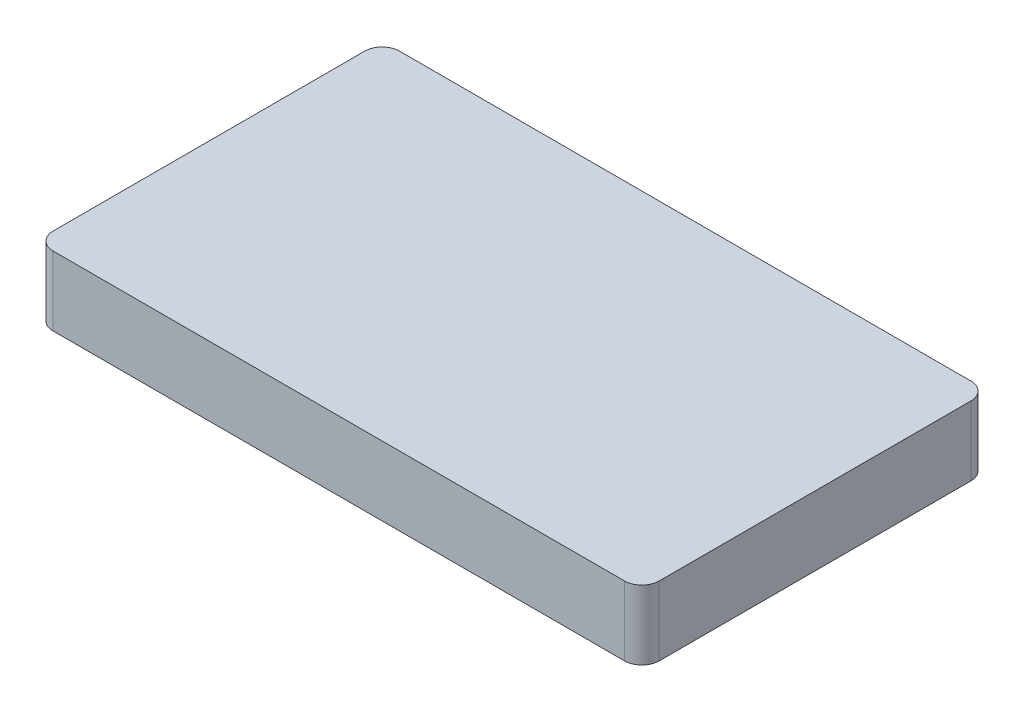
ISO-10303-21;
HEADER;
FILE_DESCRIPTION(('STEP AP214'),'2;1');
FILE_NAME('part.step','',(''),(''),'','','');
FILE_SCHEMA(('AUTOMOTIVE_DESIGN { 1 0 10303 214 1 1 1 1 }'));
ENDSEC;
DATA;
#1=APPLICATION_CONTEXT('core data for automotive mechanical design processes');
#2=APPLICATION_PROTOCOL_DEFINITION('international standard','automotive_design',2000,#1);
#3=PRODUCT_CONTEXT('',#1,'mechanical');
#4=PRODUCT('Part','Part','',(#3));
#5=PRODUCT_RELATED_PRODUCT_CATEGORY('part','',(#4));
#6=PRODUCT_DEFINITION_FORMATION('','',#4);
#7=PRODUCT_DEFINITION_CONTEXT('part definition',#1,'design');
#8=PRODUCT_DEFINITION('design','',#6,#7);
#9=PRODUCT_DEFINITION_SHAPE('','',#8);
#10=(LENGTH_UNIT() NAMED_UNIT(*) SI_UNIT(.MILLI.,.METRE.));
#11=(NAMED_UNIT(*) PLANE_ANGLE_UNIT() SI_UNIT($,.RADIAN.));
#12=(NAMED_UNIT(*) SI_UNIT($,.STERADIAN.) SOLID_ANGLE_UNIT());
#13=UNCERTAINTY_MEASURE_WITH_UNIT(LENGTH_MEASURE(1.E-05),#10,'distance_accuracy_value','');
#14=(GEOMETRIC_REPRESENTATION_CONTEXT(3) GLOBAL_UNCERTAINTY_ASSIGNED_CONTEXT((#13)) GLOBAL_UNIT_ASSIGNED_CONTEXT((#10,
#11,#12)) REPRESENTATION_CONTEXT('',''));
#15=CARTESIAN_POINT('',(0.,0.,0.));
#16=DIRECTION('',(0.,0.,1.));
#17=DIRECTION('',(1.,0.,0.));
#18=AXIS2_PLACEMENT_3D('',#15,#16,#17);
#19=CARTESIAN_POINT('',(0.,2.54,-12.7));
#20=DIRECTION('',(1.,0.,0.));
#21=DIRECTION('',(0.,0.,-1.));
#22=AXIS2_PLACEMENT_3D('',#19,#20,#21);
#23=PLANE('',#22);
#24=DIRECTION('',(0.,0.,1.));
#25=VECTOR('',#24,1.);
#26=CARTESIAN_POINT('',(0.,2.54,-12.7));
#27=LINE('',#26,#25);
#28=CARTESIAN_POINT('',(0.,2.54,-12.065));
#29=VERTEX_POINT('',#28);
#30=CARTESIAN_POINT('',(0.,2.54,-0.635));
#31=VERTEX_POINT('',#30);
#32=EDGE_CURVE('E161',#29,#31,#27,.T.);
#33=ORIENTED_EDGE('',*,*,#32,.F.);
#34=DIRECTION('',(0.,-1.,0.));
#35=VECTOR('',#34,1.);
#36=CARTESIAN_POINT('',(0.,2.54,-12.065));
#37=LINE('',#36,#35);
#38=CARTESIAN_POINT('',(0.,0.,-12.065));
#39=VERTEX_POINT('',#38);
#40=EDGE_CURVE('E186',#29,#39,#37,.T.);
#41=ORIENTED_EDGE('',*,*,#40,.T.);
#42=DIRECTION('',(0.,0.,1.));
#43=VECTOR('',#42,1.);
#44=CARTESIAN_POINT('',(0.,0.,-12.7));
#45=LINE('',#44,#43);
#46=CARTESIAN_POINT('',(0.,0.,-0.635));
#47=VERTEX_POINT('',#46);
#48=EDGE_CURVE('E174',#39,#47,#45,.T.);
#49=ORIENTED_EDGE('',*,*,#48,.T.);
#50=DIRECTION('',(0.,-1.,0.));
#51=VECTOR('',#50,1.);
#52=CARTESIAN_POINT('',(0.,2.54,-0.635));
#53=LINE('',#52,#51);
#54=EDGE_CURVE('E173',#47,#31,#53,.F.);
#55=ORIENTED_EDGE('',*,*,#54,.T.);
#56=EDGE_LOOP('',(#33,#41,#49,#55));
#57=FACE_BOUND('',#56,.T.);
#58=ADVANCED_FACE('F32',(#57),#23,.F.);
#59=CARTESIAN_POINT('',(0.,2.54,0.));
#60=DIRECTION('',(0.,0.,-1.));
#61=DIRECTION('',(-1.,0.,0.));
#62=AXIS2_PLACEMENT_3D('',#59,#60,#61);
#63=PLANE('',#62);
#64=DIRECTION('',(1.,0.,0.));
#65=VECTOR('',#64,1.);
#66=CARTESIAN_POINT('',(0.,0.,0.));
#67=LINE('',#66,#65);
#68=CARTESIAN_POINT('',(0.635,0.,0.));
#69=VERTEX_POINT('',#68);
#70=CARTESIAN_POINT('',(21.59,0.,0.));
#71=VERTEX_POINT('',#70);
#72=EDGE_CURVE('E177',#69,#71,#67,.T.);
#73=ORIENTED_EDGE('',*,*,#72,.T.);
#74=DIRECTION('',(0.,-1.,0.));
#75=VECTOR('',#74,1.);
#76=CARTESIAN_POINT('',(21.59,2.54,0.));
#77=LINE('',#76,#75);
#78=CARTESIAN_POINT('',(21.59,2.54,0.));
#79=VERTEX_POINT('',#78);
#80=EDGE_CURVE('E40',#71,#79,#77,.F.);
#81=ORIENTED_EDGE('',*,*,#80,.T.);
#82=DIRECTION('',(1.,0.,0.));
#83=VECTOR('',#82,1.);
#84=CARTESIAN_POINT('',(0.,2.54,0.));
#85=LINE('',#84,#83);
#86=CARTESIAN_POINT('',(0.635,2.54,0.));
#87=VERTEX_POINT('',#86);
#88=EDGE_CURVE('E164',#87,#79,#85,.T.);
#89=ORIENTED_EDGE('',*,*,#88,.F.);
#90=DIRECTION('',(0.,-1.,0.));
#91=VECTOR('',#90,1.);
#92=CARTESIAN_POINT('',(0.635,2.54,0.));
#93=LINE('',#92,#91);
#94=EDGE_CURVE('E214',#87,#69,#93,.T.);
#95=ORIENTED_EDGE('',*,*,#94,.T.);
#96=EDGE_LOOP('',(#73,#81,#89,#95));
#97=FACE_BOUND('',#96,.T.);
#98=ADVANCED_FACE('F219',(#97),#63,.F.);
#99=CARTESIAN_POINT('',(22.225,2.54,0.));
#100=DIRECTION('',(-1.,0.,0.));
#101=DIRECTION('',(0.,0.,1.));
#102=AXIS2_PLACEMENT_3D('',#99,#100,#101);
#103=PLANE('',#102);
#104=DIRECTION('',(0.,0.,-1.));
#105=VECTOR('',#104,1.);
#106=CARTESIAN_POINT('',(22.225,0.,0.));
#107=LINE('',#106,#105);
#108=CARTESIAN_POINT('',(22.225,0.,-0.635));
#109=VERTEX_POINT('',#108);
#110=CARTESIAN_POINT('',(22.225,0.,-12.065));
#111=VERTEX_POINT('',#110);
#112=EDGE_CURVE('E181',#109,#111,#107,.T.);
#113=ORIENTED_EDGE('',*,*,#112,.T.);
#114=DIRECTION('',(0.,-1.,0.));
#115=VECTOR('',#114,1.);
#116=CARTESIAN_POINT('',(22.225,2.54,-12.065));
#117=LINE('',#116,#115);
#118=CARTESIAN_POINT('',(22.225,2.54,-12.065));
#119=VERTEX_POINT('',#118);
#120=EDGE_CURVE('E55',#111,#119,#117,.F.);
#121=ORIENTED_EDGE('',*,*,#120,.T.);
#122=DIRECTION('',(0.,0.,-1.));
#123=VECTOR('',#122,1.);
#124=CARTESIAN_POINT('',(22.225,2.54,0.));
#125=LINE('',#124,#123);
#126=CARTESIAN_POINT('',(22.225,2.54,-0.635));
#127=VERTEX_POINT('',#126);
#128=EDGE_CURVE('E168',#127,#119,#125,.T.);
#129=ORIENTED_EDGE('',*,*,#128,.F.);
#130=DIRECTION('',(0.,-1.,0.));
#131=VECTOR('',#130,1.);
#132=CARTESIAN_POINT('',(22.225,2.54,-0.635));
#133=LINE('',#132,#131);
#134=EDGE_CURVE('E210',#127,#109,#133,.T.);
#135=ORIENTED_EDGE('',*,*,#134,.T.);
#136=EDGE_LOOP('',(#113,#121,#129,#135));
#137=FACE_BOUND('',#136,.T.);
#138=ADVANCED_FACE('F230',(#137),#103,.F.);
#139=CARTESIAN_POINT('',(22.225,2.54,-12.7));
#140=DIRECTION('',(0.,0.,1.));
#141=DIRECTION('',(1.,0.,0.));
#142=AXIS2_PLACEMENT_3D('',#139,#140,#141);
#143=PLANE('',#142);
#144=DIRECTION('',(-1.,0.,0.));
#145=VECTOR('',#144,1.);
#146=CARTESIAN_POINT('',(22.225,0.,-12.7));
#147=LINE('',#146,#145);
#148=CARTESIAN_POINT('',(21.59,0.,-12.7));
#149=VERTEX_POINT('',#148);
#150=CARTESIAN_POINT('',(0.634999999999997,0.,-12.7));
#151=VERTEX_POINT('',#150);
#152=EDGE_CURVE('E165',#149,#151,#147,.T.);
#153=ORIENTED_EDGE('',*,*,#152,.T.);
#154=DIRECTION('',(0.,-1.,0.));
#155=VECTOR('',#154,1.);
#156=CARTESIAN_POINT('',(0.634999999999997,2.54,-12.7));
#157=LINE('',#156,#155);
#158=CARTESIAN_POINT('',(0.634999999999997,2.54,-12.7));
#159=VERTEX_POINT('',#158);
#160=EDGE_CURVE('E200',#151,#159,#157,.F.);
#161=ORIENTED_EDGE('',*,*,#160,.T.);
#162=DIRECTION('',(-1.,0.,0.));
#163=VECTOR('',#162,1.);
#164=CARTESIAN_POINT('',(22.225,2.54,-12.7));
#165=LINE('',#164,#163);
#166=CARTESIAN_POINT('',(21.59,2.54,-12.7));
#167=VERTEX_POINT('',#166);
#168=EDGE_CURVE('E170',#167,#159,#165,.T.);
#169=ORIENTED_EDGE('',*,*,#168,.F.);
#170=DIRECTION('',(0.,-1.,0.));
#171=VECTOR('',#170,1.);
#172=CARTESIAN_POINT('',(21.59,2.54,-12.7));
#173=LINE('',#172,#171);
#174=EDGE_CURVE('E197',#167,#149,#173,.T.);
#175=ORIENTED_EDGE('',*,*,#174,.T.);
#176=EDGE_LOOP('',(#153,#161,#169,#175));
#177=FACE_BOUND('',#176,.T.);
#178=ADVANCED_FACE('F241',(#177),#143,.F.);
#179=CARTESIAN_POINT('',(0.,2.54,0.));
#180=DIRECTION('',(0.,1.,0.));
#181=DIRECTION('',(0.,0.,1.));
#182=AXIS2_PLACEMENT_3D('',#179,#180,#181);
#183=PLANE('',#182);
#184=ORIENTED_EDGE('',*,*,#168,.T.);
#185=CARTESIAN_POINT('',(0.634999999999995,2.54,-12.065));
#186=DIRECTION('',(0.,1.,0.));
#187=DIRECTION('',(0.,0.,1.));
#188=AXIS2_PLACEMENT_3D('',#185,#186,#187);
#189=CIRCLE('',#188,0.635);
#190=EDGE_CURVE('E208',#159,#29,#189,.T.);
#191=ORIENTED_EDGE('',*,*,#190,.T.);
#192=ORIENTED_EDGE('',*,*,#32,.T.);
#193=CARTESIAN_POINT('',(0.635,2.54,-0.635));
#194=DIRECTION('',(0.,1.,0.));
#195=DIRECTION('',(0.,0.,1.));
#196=AXIS2_PLACEMENT_3D('',#193,#194,#195);
#197=CIRCLE('',#196,0.635);
#198=EDGE_CURVE('E202',#31,#87,#197,.T.);
#199=ORIENTED_EDGE('',*,*,#198,.T.);
#200=ORIENTED_EDGE('',*,*,#88,.T.);
#201=CARTESIAN_POINT('',(21.59,2.54,-0.635));
#202=DIRECTION('',(0.,1.,0.));
#203=DIRECTION('',(0.,0.,1.));
#204=AXIS2_PLACEMENT_3D('',#201,#202,#203);
#205=CIRCLE('',#204,0.635);
#206=EDGE_CURVE('E204',#79,#127,#205,.T.);
#207=ORIENTED_EDGE('',*,*,#206,.T.);
#208=ORIENTED_EDGE('',*,*,#128,.T.);
#209=CARTESIAN_POINT('',(21.59,2.54,-12.065));
#210=DIRECTION('',(0.,1.,0.));
#211=DIRECTION('',(0.,0.,1.));
#212=AXIS2_PLACEMENT_3D('',#209,#210,#211);
#213=CIRCLE('',#212,0.635);
#214=EDGE_CURVE('E206',#119,#167,#213,.T.);
#215=ORIENTED_EDGE('',*,*,#214,.T.);
#216=EDGE_LOOP('',(#184,#191,#192,#199,#200,#207,#208,#215));
#217=FACE_BOUND('',#216,.T.);
#218=ADVANCED_FACE('F225',(#217),#183,.T.);
#219=CARTESIAN_POINT('',(0.,0.,0.));
#220=DIRECTION('',(0.,1.,0.));
#221=DIRECTION('',(0.,0.,1.));
#222=AXIS2_PLACEMENT_3D('',#219,#220,#221);
#223=PLANE('',#222);
#224=DIRECTION('',(-1.,0.,0.));
#225=VECTOR('',#224,1.);
#226=CARTESIAN_POINT('',(22.225,0.,-12.065));
#227=LINE('',#226,#225);
#228=CARTESIAN_POINT('',(21.59,0.,-12.065));
#229=VERTEX_POINT('',#228);
#230=CARTESIAN_POINT('',(0.634999999999995,0.,-12.065));
#231=VERTEX_POINT('',#230);
#232=EDGE_CURVE('E133',#229,#231,#227,.T.);
#233=ORIENTED_EDGE('',*,*,#232,.T.);
#234=DIRECTION('',(0.,0.,1.));
#235=VECTOR('',#234,1.);
#236=CARTESIAN_POINT('',(0.634999999999995,0.,-12.7));
#237=LINE('',#236,#235);
#238=CARTESIAN_POINT('',(0.635,0.,-0.635));
#239=VERTEX_POINT('',#238);
#240=EDGE_CURVE('E139',#231,#239,#237,.T.);
#241=ORIENTED_EDGE('',*,*,#240,.T.);
#242=DIRECTION('',(1.,0.,0.));
#243=VECTOR('',#242,1.);
#244=CARTESIAN_POINT('',(0.,0.,-0.635));
#245=LINE('',#244,#243);
#246=CARTESIAN_POINT('',(21.59,0.,-0.635));
#247=VERTEX_POINT('',#246);
#248=EDGE_CURVE('E155',#239,#247,#245,.T.);
#249=ORIENTED_EDGE('',*,*,#248,.T.);
#250=DIRECTION('',(0.,0.,-1.));
#251=VECTOR('',#250,1.);
#252=CARTESIAN_POINT('',(21.59,0.,0.));
#253=LINE('',#252,#251);
#254=EDGE_CURVE('E47',#247,#229,#253,.T.);
#255=ORIENTED_EDGE('',*,*,#254,.T.);
#256=EDGE_LOOP('',(#233,#241,#249,#255));
#257=FACE_BOUND('',#256,.T.);
#258=ORIENTED_EDGE('',*,*,#48,.F.);
#259=CARTESIAN_POINT('',(0.634999999999995,0.,-12.065));
#260=DIRECTION('',(0.,1.,0.));
#261=DIRECTION('',(0.,0.,1.));
#262=AXIS2_PLACEMENT_3D('',#259,#260,#261);
#263=CIRCLE('',#262,0.635);
#264=EDGE_CURVE('E195',#39,#151,#263,.F.);
#265=ORIENTED_EDGE('',*,*,#264,.T.);
#266=ORIENTED_EDGE('',*,*,#152,.F.);
#267=CARTESIAN_POINT('',(21.59,0.,-12.065));
#268=DIRECTION('',(0.,1.,0.));
#269=DIRECTION('',(0.,0.,1.));
#270=AXIS2_PLACEMENT_3D('',#267,#268,#269);
#271=CIRCLE('',#270,0.635);
#272=EDGE_CURVE('E193',#149,#111,#271,.F.);
#273=ORIENTED_EDGE('',*,*,#272,.T.);
#274=ORIENTED_EDGE('',*,*,#112,.F.);
#275=CARTESIAN_POINT('',(21.59,0.,-0.635));
#276=DIRECTION('',(0.,1.,0.));
#277=DIRECTION('',(0.,0.,1.));
#278=AXIS2_PLACEMENT_3D('',#275,#276,#277);
#279=CIRCLE('',#278,0.635);
#280=EDGE_CURVE('E191',#109,#71,#279,.F.);
#281=ORIENTED_EDGE('',*,*,#280,.T.);
#282=ORIENTED_EDGE('',*,*,#72,.F.);
#283=CARTESIAN_POINT('',(0.635,0.,-0.635));
#284=DIRECTION('',(0.,1.,0.));
#285=DIRECTION('',(0.,0.,1.));
#286=AXIS2_PLACEMENT_3D('',#283,#284,#285);
#287=CIRCLE('',#286,0.635);
#288=EDGE_CURVE('E189',#69,#47,#287,.F.);
#289=ORIENTED_EDGE('',*,*,#288,.T.);
#290=EDGE_LOOP('',(#258,#265,#266,#273,#274,#281,#282,#289));
#291=FACE_BOUND('',#290,.T.);
#292=ADVANCED_FACE('F233',(#257,#291),#223,.F.);
#293=CARTESIAN_POINT('',(0.634999999999995,2.54,-12.065));
#294=DIRECTION('',(0.,-1.,0.));
#295=DIRECTION('',(0.,0.,-1.));
#296=AXIS2_PLACEMENT_3D('',#293,#294,#295);
#297=CYLINDRICAL_SURFACE('',#296,0.635);
#298=ORIENTED_EDGE('',*,*,#190,.F.);
#299=ORIENTED_EDGE('',*,*,#160,.F.);
#300=ORIENTED_EDGE('',*,*,#264,.F.);
#301=ORIENTED_EDGE('',*,*,#40,.F.);
#302=EDGE_LOOP('',(#298,#299,#300,#301));
#303=FACE_BOUND('',#302,.T.);
#304=ADVANCED_FACE('F247',(#303),#297,.T.);
#305=CARTESIAN_POINT('',(21.59,2.54,-12.065));
#306=DIRECTION('',(0.,-1.,0.));
#307=DIRECTION('',(0.,0.,-1.));
#308=AXIS2_PLACEMENT_3D('',#305,#306,#307);
#309=CYLINDRICAL_SURFACE('',#308,0.635);
#310=ORIENTED_EDGE('',*,*,#214,.F.);
#311=ORIENTED_EDGE('',*,*,#120,.F.);
#312=ORIENTED_EDGE('',*,*,#272,.F.);
#313=ORIENTED_EDGE('',*,*,#174,.F.);
#314=EDGE_LOOP('',(#310,#311,#312,#313));
#315=FACE_BOUND('',#314,.T.);
#316=ADVANCED_FACE('F238',(#315),#309,.T.);
#317=CARTESIAN_POINT('',(21.59,2.54,-0.635));
#318=DIRECTION('',(0.,-1.,0.));
#319=DIRECTION('',(0.,0.,-1.));
#320=AXIS2_PLACEMENT_3D('',#317,#318,#319);
#321=CYLINDRICAL_SURFACE('',#320,0.635);
#322=ORIENTED_EDGE('',*,*,#206,.F.);
#323=ORIENTED_EDGE('',*,*,#80,.F.);
#324=ORIENTED_EDGE('',*,*,#280,.F.);
#325=ORIENTED_EDGE('',*,*,#134,.F.);
#326=EDGE_LOOP('',(#322,#323,#324,#325));
#327=FACE_BOUND('',#326,.T.);
#328=ADVANCED_FACE('F228',(#327),#321,.T.);
#329=CARTESIAN_POINT('',(0.635,2.54,-0.635));
#330=DIRECTION('',(0.,-1.,0.));
#331=DIRECTION('',(0.,0.,-1.));
#332=AXIS2_PLACEMENT_3D('',#329,#330,#331);
#333=CYLINDRICAL_SURFACE('',#332,0.635);
#334=ORIENTED_EDGE('',*,*,#198,.F.);
#335=ORIENTED_EDGE('',*,*,#54,.F.);
#336=ORIENTED_EDGE('',*,*,#288,.F.);
#337=ORIENTED_EDGE('',*,*,#94,.F.);
#338=EDGE_LOOP('',(#334,#335,#336,#337));
#339=FACE_BOUND('',#338,.T.);
#340=ADVANCED_FACE('F34',(#339),#333,.T.);
#341=CARTESIAN_POINT('',(0.634999999999995,2.54,-12.7));
#342=DIRECTION('',(1.,0.,0.));
#343=DIRECTION('',(0.,0.,-1.));
#344=AXIS2_PLACEMENT_3D('',#341,#342,#343);
#345=PLANE('',#344);
#346=DIRECTION('',(0.,0.,1.));
#347=VECTOR('',#346,1.);
#348=CARTESIAN_POINT('',(0.634999999999995,1.905,-12.7));
#349=LINE('',#348,#347);
#350=CARTESIAN_POINT('',(0.634999999999995,1.905,-12.065));
#351=VERTEX_POINT('',#350);
#352=CARTESIAN_POINT('',(0.635,1.905,-0.635));
#353=VERTEX_POINT('',#352);
#354=EDGE_CURVE('E123',#351,#353,#349,.T.);
#355=ORIENTED_EDGE('',*,*,#354,.T.);
#356=DIRECTION('',(0.,1.,0.));
#357=VECTOR('',#356,1.);
#358=CARTESIAN_POINT('',(0.635,2.54,-0.635));
#359=LINE('',#358,#357);
#360=EDGE_CURVE('E144',#239,#353,#359,.T.);
#361=ORIENTED_EDGE('',*,*,#360,.F.);
#362=ORIENTED_EDGE('',*,*,#240,.F.);
#363=DIRECTION('',(0.,1.,0.));
#364=VECTOR('',#363,1.);
#365=CARTESIAN_POINT('',(0.634999999999993,2.54,-12.065));
#366=LINE('',#365,#364);
#367=EDGE_CURVE('E136',#231,#351,#366,.T.);
#368=ORIENTED_EDGE('',*,*,#367,.T.);
#369=EDGE_LOOP('',(#355,#361,#362,#368));
#370=FACE_BOUND('',#369,.T.);
#371=ADVANCED_FACE('F137',(#370),#345,.T.);
#372=CARTESIAN_POINT('',(0.,2.54,-0.635));
#373=DIRECTION('',(0.,0.,-1.));
#374=DIRECTION('',(-1.,0.,0.));
#375=AXIS2_PLACEMENT_3D('',#372,#373,#374);
#376=PLANE('',#375);
#377=ORIENTED_EDGE('',*,*,#248,.F.);
#378=ORIENTED_EDGE('',*,*,#360,.T.);
#379=DIRECTION('',(1.,0.,0.));
#380=VECTOR('',#379,1.);
#381=CARTESIAN_POINT('',(0.,1.905,-0.635));
#382=LINE('',#381,#380);
#383=CARTESIAN_POINT('',(21.59,1.905,-0.635));
#384=VERTEX_POINT('',#383);
#385=EDGE_CURVE('E130',#353,#384,#382,.T.);
#386=ORIENTED_EDGE('',*,*,#385,.T.);
#387=DIRECTION('',(0.,1.,0.));
#388=VECTOR('',#387,1.);
#389=CARTESIAN_POINT('',(21.59,2.54,-0.635));
#390=LINE('',#389,#388);
#391=EDGE_CURVE('E178',#247,#384,#390,.T.);
#392=ORIENTED_EDGE('',*,*,#391,.F.);
#393=EDGE_LOOP('',(#377,#378,#386,#392));
#394=FACE_BOUND('',#393,.T.);
#395=ADVANCED_FACE('F256',(#394),#376,.T.);
#396=CARTESIAN_POINT('',(21.59,2.54,0.));
#397=DIRECTION('',(-1.,0.,0.));
#398=DIRECTION('',(0.,0.,1.));
#399=AXIS2_PLACEMENT_3D('',#396,#397,#398);
#400=PLANE('',#399);
#401=ORIENTED_EDGE('',*,*,#254,.F.);
#402=ORIENTED_EDGE('',*,*,#391,.T.);
#403=DIRECTION('',(0.,0.,-1.));
#404=VECTOR('',#403,1.);
#405=CARTESIAN_POINT('',(21.59,1.905,0.));
#406=LINE('',#405,#404);
#407=CARTESIAN_POINT('',(21.59,1.905,-12.065));
#408=VERTEX_POINT('',#407);
#409=EDGE_CURVE('E148',#384,#408,#406,.T.);
#410=ORIENTED_EDGE('',*,*,#409,.T.);
#411=DIRECTION('',(0.,1.,0.));
#412=VECTOR('',#411,1.);
#413=CARTESIAN_POINT('',(21.59,2.54,-12.065));
#414=LINE('',#413,#412);
#415=EDGE_CURVE('E143',#229,#408,#414,.T.);
#416=ORIENTED_EDGE('',*,*,#415,.F.);
#417=EDGE_LOOP('',(#401,#402,#410,#416));
#418=FACE_BOUND('',#417,.T.);
#419=ADVANCED_FACE('F308',(#418),#400,.T.);
#420=CARTESIAN_POINT('',(22.225,2.54,-12.065));
#421=DIRECTION('',(0.,0.,1.));
#422=DIRECTION('',(1.,0.,0.));
#423=AXIS2_PLACEMENT_3D('',#420,#421,#422);
#424=PLANE('',#423);
#425=ORIENTED_EDGE('',*,*,#232,.F.);
#426=ORIENTED_EDGE('',*,*,#415,.T.);
#427=DIRECTION('',(-1.,0.,0.));
#428=VECTOR('',#427,1.);
#429=CARTESIAN_POINT('',(22.225,1.905,-12.065));
#430=LINE('',#429,#428);
#431=EDGE_CURVE('E127',#408,#351,#430,.T.);
#432=ORIENTED_EDGE('',*,*,#431,.T.);
#433=ORIENTED_EDGE('',*,*,#367,.F.);
#434=EDGE_LOOP('',(#425,#426,#432,#433));
#435=FACE_BOUND('',#434,.T.);
#436=ADVANCED_FACE('F146',(#435),#424,.T.);
#437=CARTESIAN_POINT('',(0.,1.905,0.));
#438=DIRECTION('',(0.,1.,0.));
#439=DIRECTION('',(0.,0.,1.));
#440=AXIS2_PLACEMENT_3D('',#437,#438,#439);
#441=PLANE('',#440);
#442=CARTESIAN_POINT('',(11.1125,1.905,-6.35));
#443=DIRECTION('',(0.,1.,0.));
#444=DIRECTION('',(0.,0.,1.));
#445=AXIS2_PLACEMENT_3D('',#442,#443,#444);
#446=CIRCLE('',#445,2.54);
#447=CARTESIAN_POINT('',(11.1125,1.905,-3.81));
#448=VERTEX_POINT('',#447);
#449=EDGE_CURVE('E11',#448,#448,#446,.F.);
#450=ORIENTED_EDGE('',*,*,#449,.F.);
#451=EDGE_LOOP('',(#450));
#452=FACE_BOUND('',#451,.T.);
#453=ORIENTED_EDGE('',*,*,#431,.F.);
#454=ORIENTED_EDGE('',*,*,#409,.F.);
#455=ORIENTED_EDGE('',*,*,#385,.F.);
#456=ORIENTED_EDGE('',*,*,#354,.F.);
#457=EDGE_LOOP('',(#453,#454,#455,#456));
#458=FACE_BOUND('',#457,.T.);
#459=ADVANCED_FACE('F125',(#452,#458),#441,.F.);
#460=CARTESIAN_POINT('',(11.1125,-7.18420489685532,-6.35));
#461=DIRECTION('',(0.,1.,0.));
#462=DIRECTION('',(0.,0.,1.));
#463=AXIS2_PLACEMENT_3D('',#460,#461,#462);
#464=CYLINDRICAL_SURFACE('',#463,2.54);
#465=CARTESIAN_POINT('',(11.1125,0.,-6.35));
#466=DIRECTION('',(0.,1.,0.));
#467=DIRECTION('',(0.,0.,1.));
#468=AXIS2_PLACEMENT_3D('',#465,#466,#467);
#469=CIRCLE('',#468,2.54);
#470=CARTESIAN_POINT('',(11.1125,0.,-3.81));
#471=VERTEX_POINT('',#470);
#472=EDGE_CURVE('E156',#471,#471,#469,.T.);
#473=CARTESIAN_POINT('',(11.1125,0.,-3.81));
#474=CARTESIAN_POINT('',(11.1125,0.0198437499999991,-3.81));
#475=CARTESIAN_POINT('',(11.1125,0.0396874999999989,-3.81));
#476=CARTESIAN_POINT('',(11.1125,0.079374999999999,-3.81));
#477=CARTESIAN_POINT('',(11.1125,0.0992187499999992,-3.81));
#478=CARTESIAN_POINT('',(11.1125,0.138906249999999,-3.81));
#479=CARTESIAN_POINT('',(11.1125,0.158749999999999,-3.81));
#480=CARTESIAN_POINT('',(11.1125,0.198437499999999,-3.81));
#481=CARTESIAN_POINT('',(11.1125,0.218281249999999,-3.81));
#482=CARTESIAN_POINT('',(11.1125,0.25796875,-3.81));
#483=CARTESIAN_POINT('',(11.1125,0.277812499999999,-3.81));
#484=CARTESIAN_POINT('',(11.1125,0.317499999999999,-3.81));
#485=CARTESIAN_POINT('',(11.1125,0.337343749999999,-3.81));
#486=CARTESIAN_POINT('',(11.1125,0.377031249999999,-3.81));
#487=CARTESIAN_POINT('',(11.1125,0.396874999999999,-3.81));
#488=CARTESIAN_POINT('',(11.1125,0.436562499999999,-3.81));
#489=CARTESIAN_POINT('',(11.1125,0.456406249999999,-3.81));
#490=CARTESIAN_POINT('',(11.1125,0.496093749999999,-3.81));
#491=CARTESIAN_POINT('',(11.1125,0.515937499999999,-3.81));
#492=CARTESIAN_POINT('',(11.1125,0.555624999999999,-3.81));
#493=CARTESIAN_POINT('',(11.1125,0.575468749999999,-3.81));
#494=CARTESIAN_POINT('',(11.1125,0.615156249999999,-3.81));
#495=CARTESIAN_POINT('',(11.1125,0.634999999999999,-3.81));
#496=CARTESIAN_POINT('',(11.1125,0.674687499999998,-3.81));
#497=CARTESIAN_POINT('',(11.1125,0.694531249999998,-3.81));
#498=CARTESIAN_POINT('',(11.1125,0.734218749999998,-3.81));
#499=CARTESIAN_POINT('',(11.1125,0.754062499999998,-3.81));
#500=CARTESIAN_POINT('',(11.1125,0.793749999999998,-3.81));
#501=CARTESIAN_POINT('',(11.1125,0.813593749999999,-3.81));
#502=CARTESIAN_POINT('',(11.1125,0.853281249999999,-3.81));
#503=CARTESIAN_POINT('',(11.1125,0.873124999999999,-3.81));
#504=CARTESIAN_POINT('',(11.1125,0.912812499999999,-3.81));
#505=CARTESIAN_POINT('',(11.1125,0.932656249999999,-3.81));
#506=CARTESIAN_POINT('',(11.1125,0.972343749999998,-3.81));
#507=CARTESIAN_POINT('',(11.1125,0.992187499999998,-3.81));
#508=CARTESIAN_POINT('',(11.1125,1.031875,-3.81));
#509=CARTESIAN_POINT('',(11.1125,1.05171875,-3.81));
#510=CARTESIAN_POINT('',(11.1125,1.09140625,-3.81));
#511=CARTESIAN_POINT('',(11.1125,1.11125,-3.81));
#512=CARTESIAN_POINT('',(11.1125,1.1509375,-3.81));
#513=CARTESIAN_POINT('',(11.1125,1.17078125,-3.81));
#514=CARTESIAN_POINT('',(11.1125,1.21046875,-3.81));
#515=CARTESIAN_POINT('',(11.1125,1.2303125,-3.81));
#516=CARTESIAN_POINT('',(11.1125,1.27,-3.81));
#517=CARTESIAN_POINT('',(11.1125,1.28984375,-3.81));
#518=CARTESIAN_POINT('',(11.1125,1.32953125,-3.81));
#519=CARTESIAN_POINT('',(11.1125,1.349375,-3.81));
#520=CARTESIAN_POINT('',(11.1125,1.3890625,-3.81));
#521=CARTESIAN_POINT('',(11.1125,1.40890625,-3.81));
#522=CARTESIAN_POINT('',(11.1125,1.44859375,-3.81));
#523=CARTESIAN_POINT('',(11.1125,1.4684375,-3.81));
#524=CARTESIAN_POINT('',(11.1125,1.508125,-3.81));
#525=CARTESIAN_POINT('',(11.1125,1.52796875,-3.81));
#526=CARTESIAN_POINT('',(11.1125,1.56765625,-3.81));
#527=CARTESIAN_POINT('',(11.1125,1.5875,-3.81));
#528=CARTESIAN_POINT('',(11.1125,1.6271875,-3.81));
#529=CARTESIAN_POINT('',(11.1125,1.64703125,-3.81));
#530=CARTESIAN_POINT('',(11.1125,1.68671875,-3.81));
#531=CARTESIAN_POINT('',(11.1125,1.7065625,-3.81));
#532=CARTESIAN_POINT('',(11.1125,1.74625,-3.81));
#533=CARTESIAN_POINT('',(11.1125,1.76609375,-3.81));
#534=CARTESIAN_POINT('',(11.1125,1.80578125,-3.81));
#535=CARTESIAN_POINT('',(11.1125,1.825625,-3.81));
#536=CARTESIAN_POINT('',(11.1125,1.8653125,-3.81));
#537=CARTESIAN_POINT('',(11.1125,1.88515625,-3.81));
#538=CARTESIAN_POINT('',(11.1125,1.905,-3.81));
#539=B_SPLINE_CURVE_WITH_KNOTS('',3,(#473,#474,#475,#476,#477,#478,#479,#480,#481,#482,#483,
#484,#485,#486,#487,#488,#489,#490,#491,#492,#493,#494,#495,#496,#497,#498,#499,#500,#501,#502,
#503,#504,#505,#506,#507,#508,#509,#510,#511,#512,#513,#514,#515,#516,#517,#518,#519,#520,#521,
#522,#523,#524,#525,#526,#527,#528,#529,#530,#531,#532,#533,#534,#535,#536,#537,#538),
.UNSPECIFIED.,.F.,.F.,(4,2,2,2,2,2,2,2,2,2,2,2,2,2,2,2,2,2,2,2,2,2,2,2,2,2,2,2,2,2,2,2,4),(0.,
0.0595312499999997,0.1190625,0.17859375,0.238125,0.29765625,0.3571875,0.41671875,0.47625,
0.53578125,0.5953125,0.654843749999999,0.714374999999999,0.773906249999999,0.8334375,0.89296875,
0.952499999999999,1.01203125,1.0715625,1.13109375,1.190625,1.25015625,1.3096875,1.36921875,
1.42875,1.48828125,1.5478125,1.60734375,1.666875,1.72640625,1.7859375,1.84546875,1.905),.UNSPECIFIED.);
#540=EDGE_CURVE('BSEAM334',#471,#448,#539,.T.);
#541=ORIENTED_EDGE('',*,*,#472,.T.);
#542=ORIENTED_EDGE('',*,*,#449,.T.);
#543=ORIENTED_EDGE('',*,*,#540,.T.);
#544=ORIENTED_EDGE('',*,*,#540,.F.);
#545=EDGE_LOOP('',(#541,#543,#542,#544));
#546=FACE_BOUND('',#545,.T.);
#547=ADVANCED_FACE('F334',(#546),#464,.T.);
#548=CARTESIAN_POINT('',(0.,0.,0.));
#549=DIRECTION('',(0.,1.,0.));
#550=DIRECTION('',(0.,0.,1.));
#551=AXIS2_PLACEMENT_3D('',#548,#549,#550);
#552=PLANE('',#551);
#553=ORIENTED_EDGE('',*,*,#472,.F.);
#554=EDGE_LOOP('',(#553));
#555=FACE_BOUND('',#554,.T.);
#556=ADVANCED_FACE('F344',(#555),#552,.F.);
#557=CLOSED_SHELL('',(#58,#98,#138,#178,#218,#292,#304,#316,#328,#340,#371,#395,#419,#436,#459,
#547,#556));
#558=MANIFOLD_SOLID_BREP('B2',#557);
#559=ADVANCED_BREP_SHAPE_REPRESENTATION('',(#18,#558),#14);
#560=SHAPE_DEFINITION_REPRESENTATION(#9,#559);
ENDSEC;
END-ISO-10303-21;
